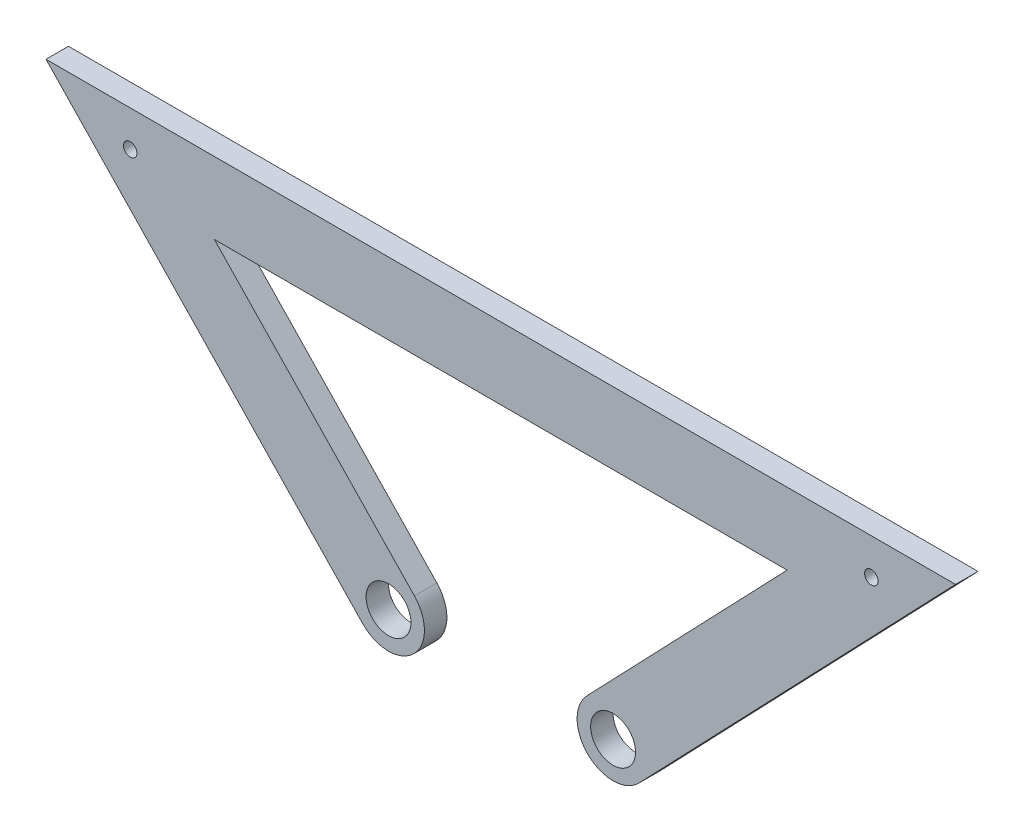
ISO-10303-21;
HEADER;
FILE_DESCRIPTION(('STEP AP214'),'2;1');
FILE_NAME('part.step','',(''),(''),'','','');
FILE_SCHEMA(('AUTOMOTIVE_DESIGN { 1 0 10303 214 1 1 1 1 }'));
ENDSEC;
DATA;
#1=APPLICATION_CONTEXT('core data for automotive mechanical design processes');
#2=APPLICATION_PROTOCOL_DEFINITION('international standard','automotive_design',2000,#1);
#3=PRODUCT_CONTEXT('',#1,'mechanical');
#4=PRODUCT('Part','Part','',(#3));
#5=PRODUCT_RELATED_PRODUCT_CATEGORY('part','',(#4));
#6=PRODUCT_DEFINITION_FORMATION('','',#4);
#7=PRODUCT_DEFINITION_CONTEXT('part definition',#1,'design');
#8=PRODUCT_DEFINITION('design','',#6,#7);
#9=PRODUCT_DEFINITION_SHAPE('','',#8);
#10=(LENGTH_UNIT() NAMED_UNIT(*) SI_UNIT(.MILLI.,.METRE.));
#11=(NAMED_UNIT(*) PLANE_ANGLE_UNIT() SI_UNIT($,.RADIAN.));
#12=(NAMED_UNIT(*) SI_UNIT($,.STERADIAN.) SOLID_ANGLE_UNIT());
#13=UNCERTAINTY_MEASURE_WITH_UNIT(LENGTH_MEASURE(1.E-05),#10,'distance_accuracy_value','');
#14=(GEOMETRIC_REPRESENTATION_CONTEXT(3) GLOBAL_UNCERTAINTY_ASSIGNED_CONTEXT((#13)) GLOBAL_UNIT_ASSIGNED_CONTEXT((#10,
#11,#12)) REPRESENTATION_CONTEXT('',''));
#15=CARTESIAN_POINT('',(0.,0.,0.));
#16=DIRECTION('',(0.,0.,1.));
#17=DIRECTION('',(1.,0.,0.));
#18=AXIS2_PLACEMENT_3D('',#15,#16,#17);
#19=CARTESIAN_POINT('',(-101.247180092397,112.78837439414,-7.5));
#20=DIRECTION('',(-0.721988205115424,-0.691905363235615,0.));
#21=DIRECTION('',(0.691905363235615,-0.721988205115424,0.));
#22=AXIS2_PLACEMENT_3D('',#19,#20,#21);
#23=PLANE('',#22);
#24=DIRECTION('',(0.691905363235615,-0.721988205115424,0.));
#25=VECTOR('',#24,1.);
#26=CARTESIAN_POINT('',(-101.247180092397,112.78837439414,-2.5));
#27=LINE('',#26,#25);
#28=CARTESIAN_POINT('',(-101.247180092397,112.78837439414,-2.5));
#29=VERTEX_POINT('',#28);
#30=CARTESIAN_POINT('',(-30.7759056409234,39.2531314882555,-2.5));
#31=VERTEX_POINT('',#30);
#32=EDGE_CURVE('E133',#29,#31,#27,.T.);
#33=ORIENTED_EDGE('',*,*,#32,.F.);
#34=DIRECTION('',(0.,0.,1.));
#35=VECTOR('',#34,1.);
#36=CARTESIAN_POINT('',(-101.247180092397,112.78837439414,-7.5));
#37=LINE('',#36,#35);
#38=CARTESIAN_POINT('',(-101.247180092397,112.78837439414,-7.5));
#39=VERTEX_POINT('',#38);
#40=EDGE_CURVE('E11',#39,#29,#37,.T.);
#41=ORIENTED_EDGE('',*,*,#40,.F.);
#42=DIRECTION('',(0.691905363235615,-0.721988205115424,0.));
#43=VECTOR('',#42,1.);
#44=CARTESIAN_POINT('',(-101.247180092397,112.78837439414,-7.5));
#45=LINE('',#44,#43);
#46=CARTESIAN_POINT('',(-30.7759056409234,39.2531314882555,-7.5));
#47=VERTEX_POINT('',#46);
#48=EDGE_CURVE('E151',#39,#47,#45,.T.);
#49=ORIENTED_EDGE('',*,*,#48,.T.);
#50=DIRECTION('',(0.,0.,1.));
#51=VECTOR('',#50,1.);
#52=CARTESIAN_POINT('',(-30.7759056409234,39.2531314882555,-7.5));
#53=LINE('',#52,#51);
#54=EDGE_CURVE('E38',#47,#31,#53,.T.);
#55=ORIENTED_EDGE('',*,*,#54,.T.);
#56=EDGE_LOOP('',(#33,#41,#49,#55));
#57=FACE_BOUND('',#56,.T.);
#58=ADVANCED_FACE('F35',(#57),#23,.T.);
#59=CARTESIAN_POINT('',(-101.247180092397,112.78837439414,-7.5));
#60=DIRECTION('',(0.,-1.,0.));
#61=DIRECTION('',(0.,0.,-1.));
#62=AXIS2_PLACEMENT_3D('',#59,#60,#61);
#63=PLANE('',#62);
#64=DIRECTION('',(1.,0.,0.));
#65=VECTOR('',#64,1.);
#66=CARTESIAN_POINT('',(-101.247180092397,112.78837439414,-2.5));
#67=LINE('',#66,#65);
#68=CARTESIAN_POINT('',(101.247180092396,112.78837439414,-2.5));
#69=VERTEX_POINT('',#68);
#70=EDGE_CURVE('E80',#29,#69,#67,.T.);
#71=ORIENTED_EDGE('',*,*,#70,.T.);
#72=DIRECTION('',(0.,0.,1.));
#73=VECTOR('',#72,1.);
#74=CARTESIAN_POINT('',(101.247180092396,112.78837439414,-7.5));
#75=LINE('',#74,#73);
#76=CARTESIAN_POINT('',(101.247180092396,112.78837439414,-7.5));
#77=VERTEX_POINT('',#76);
#78=EDGE_CURVE('E44',#77,#69,#75,.T.);
#79=ORIENTED_EDGE('',*,*,#78,.F.);
#80=DIRECTION('',(1.,0.,0.));
#81=VECTOR('',#80,1.);
#82=CARTESIAN_POINT('',(-101.247180092397,112.78837439414,-7.5));
#83=LINE('',#82,#81);
#84=EDGE_CURVE('E112',#39,#77,#83,.T.);
#85=ORIENTED_EDGE('',*,*,#84,.F.);
#86=ORIENTED_EDGE('',*,*,#40,.T.);
#87=EDGE_LOOP('',(#71,#79,#85,#86));
#88=FACE_BOUND('',#87,.T.);
#89=ADVANCED_FACE('F236',(#88),#63,.F.);
#90=CARTESIAN_POINT('',(101.247180092396,112.78837439414,-7.5));
#91=DIRECTION('',(-0.721988205115424,0.691905363235615,0.));
#92=DIRECTION('',(-0.691905363235615,-0.721988205115424,0.));
#93=AXIS2_PLACEMENT_3D('',#90,#91,#92);
#94=PLANE('',#93);
#95=DIRECTION('',(-0.691905363235615,-0.721988205115424,0.));
#96=VECTOR('',#95,1.);
#97=CARTESIAN_POINT('',(101.247180092396,112.78837439414,-2.5));
#98=LINE('',#97,#96);
#99=CARTESIAN_POINT('',(30.7759056409234,39.2531314882555,-2.5));
#100=VERTEX_POINT('',#99);
#101=EDGE_CURVE('E119',#69,#100,#98,.T.);
#102=ORIENTED_EDGE('',*,*,#101,.T.);
#103=DIRECTION('',(0.,0.,1.));
#104=VECTOR('',#103,1.);
#105=CARTESIAN_POINT('',(30.7759056409234,39.2531314882555,-7.5));
#106=LINE('',#105,#104);
#107=CARTESIAN_POINT('',(30.7759056409234,39.2531314882555,-7.5));
#108=VERTEX_POINT('',#107);
#109=EDGE_CURVE('E116',#108,#100,#106,.T.);
#110=ORIENTED_EDGE('',*,*,#109,.F.);
#111=DIRECTION('',(-0.691905363235615,-0.721988205115424,0.));
#112=VECTOR('',#111,1.);
#113=CARTESIAN_POINT('',(101.247180092396,112.78837439414,-7.5));
#114=LINE('',#113,#112);
#115=EDGE_CURVE('E105',#77,#108,#114,.T.);
#116=ORIENTED_EDGE('',*,*,#115,.F.);
#117=ORIENTED_EDGE('',*,*,#78,.T.);
#118=EDGE_LOOP('',(#102,#110,#116,#117));
#119=FACE_BOUND('',#118,.T.);
#120=ADVANCED_FACE('F117',(#119),#94,.F.);
#121=CARTESIAN_POINT('',(25.,44.7883743941404,-7.5));
#122=DIRECTION('',(0.,0.,1.));
#123=DIRECTION('',(1.,0.,0.));
#124=AXIS2_PLACEMENT_3D('',#121,#122,#123);
#125=CYLINDRICAL_SURFACE('',#124,8.);
#126=CARTESIAN_POINT('',(25.,44.7883743941404,-2.5));
#127=DIRECTION('',(0.,0.,1.));
#128=DIRECTION('',(1.,0.,0.));
#129=AXIS2_PLACEMENT_3D('',#126,#127,#128);
#130=CIRCLE('',#129,8.);
#131=CARTESIAN_POINT('',(19.2240943590766,50.3236173000254,-2.5));
#132=VERTEX_POINT('',#131);
#133=EDGE_CURVE('E148',#132,#100,#130,.T.);
#134=ORIENTED_EDGE('',*,*,#133,.F.);
#135=DIRECTION('',(0.,0.,1.));
#136=VECTOR('',#135,1.);
#137=CARTESIAN_POINT('',(19.2240943590766,50.3236173000254,-7.5));
#138=LINE('',#137,#136);
#139=CARTESIAN_POINT('',(19.2240943590766,50.3236173000254,-7.5));
#140=VERTEX_POINT('',#139);
#141=EDGE_CURVE('E123',#140,#132,#138,.T.);
#142=ORIENTED_EDGE('',*,*,#141,.F.);
#143=CARTESIAN_POINT('',(25.,44.7883743941404,-7.5));
#144=DIRECTION('',(0.,0.,1.));
#145=DIRECTION('',(1.,0.,0.));
#146=AXIS2_PLACEMENT_3D('',#143,#144,#145);
#147=CIRCLE('',#146,8.);
#148=EDGE_CURVE('E110',#140,#108,#147,.T.);
#149=ORIENTED_EDGE('',*,*,#148,.T.);
#150=ORIENTED_EDGE('',*,*,#109,.T.);
#151=EDGE_LOOP('',(#134,#142,#149,#150));
#152=FACE_BOUND('',#151,.T.);
#153=ADVANCED_FACE('F125',(#152),#125,.T.);
#154=CARTESIAN_POINT('',(63.7528199076035,96.7883743941404,-7.5));
#155=DIRECTION('',(-0.721988205115424,0.691905363235615,0.));
#156=DIRECTION('',(-0.691905363235615,-0.721988205115424,0.));
#157=AXIS2_PLACEMENT_3D('',#154,#155,#156);
#158=PLANE('',#157);
#159=DIRECTION('',(-0.691905363235615,-0.721988205115424,0.));
#160=VECTOR('',#159,1.);
#161=CARTESIAN_POINT('',(63.7528199076035,96.7883743941404,-2.5));
#162=LINE('',#161,#160);
#163=CARTESIAN_POINT('',(63.7528199076035,96.7883743941404,-2.5));
#164=VERTEX_POINT('',#163);
#165=EDGE_CURVE('E145',#164,#132,#162,.T.);
#166=ORIENTED_EDGE('',*,*,#165,.F.);
#167=DIRECTION('',(0.,0.,1.));
#168=VECTOR('',#167,1.);
#169=CARTESIAN_POINT('',(63.7528199076035,96.7883743941404,-7.5));
#170=LINE('',#169,#168);
#171=CARTESIAN_POINT('',(63.7528199076035,96.7883743941404,-7.5));
#172=VERTEX_POINT('',#171);
#173=EDGE_CURVE('E155',#172,#164,#170,.T.);
#174=ORIENTED_EDGE('',*,*,#173,.F.);
#175=DIRECTION('',(-0.691905363235615,-0.721988205115424,0.));
#176=VECTOR('',#175,1.);
#177=CARTESIAN_POINT('',(63.7528199076035,96.7883743941404,-7.5));
#178=LINE('',#177,#176);
#179=EDGE_CURVE('E126',#172,#140,#178,.T.);
#180=ORIENTED_EDGE('',*,*,#179,.T.);
#181=ORIENTED_EDGE('',*,*,#141,.T.);
#182=EDGE_LOOP('',(#166,#174,#180,#181));
#183=FACE_BOUND('',#182,.T.);
#184=ADVANCED_FACE('F170',(#183),#158,.T.);
#185=CARTESIAN_POINT('',(-63.7528199076036,96.7883743941404,-7.5));
#186=DIRECTION('',(0.,-1.,0.));
#187=DIRECTION('',(0.,0.,-1.));
#188=AXIS2_PLACEMENT_3D('',#185,#186,#187);
#189=PLANE('',#188);
#190=DIRECTION('',(1.,0.,0.));
#191=VECTOR('',#190,1.);
#192=CARTESIAN_POINT('',(-63.7528199076036,96.7883743941404,-2.5));
#193=LINE('',#192,#191);
#194=CARTESIAN_POINT('',(-63.7528199076036,96.7883743941404,-2.5));
#195=VERTEX_POINT('',#194);
#196=EDGE_CURVE('E142',#195,#164,#193,.T.);
#197=ORIENTED_EDGE('',*,*,#196,.F.);
#198=DIRECTION('',(0.,0.,1.));
#199=VECTOR('',#198,1.);
#200=CARTESIAN_POINT('',(-63.7528199076036,96.7883743941404,-7.5));
#201=LINE('',#200,#199);
#202=CARTESIAN_POINT('',(-63.7528199076036,96.7883743941404,-7.5));
#203=VERTEX_POINT('',#202);
#204=EDGE_CURVE('E157',#203,#195,#201,.T.);
#205=ORIENTED_EDGE('',*,*,#204,.F.);
#206=DIRECTION('',(1.,0.,0.));
#207=VECTOR('',#206,1.);
#208=CARTESIAN_POINT('',(-63.7528199076036,96.7883743941404,-7.5));
#209=LINE('',#208,#207);
#210=EDGE_CURVE('E128',#203,#172,#209,.T.);
#211=ORIENTED_EDGE('',*,*,#210,.T.);
#212=ORIENTED_EDGE('',*,*,#173,.T.);
#213=EDGE_LOOP('',(#197,#205,#211,#212));
#214=FACE_BOUND('',#213,.T.);
#215=ADVANCED_FACE('F174',(#214),#189,.T.);
#216=CARTESIAN_POINT('',(-63.7528199076036,96.7883743941404,-7.5));
#217=DIRECTION('',(-0.721988205115424,-0.691905363235615,0.));
#218=DIRECTION('',(0.691905363235615,-0.721988205115424,0.));
#219=AXIS2_PLACEMENT_3D('',#216,#217,#218);
#220=PLANE('',#219);
#221=DIRECTION('',(0.691905363235615,-0.721988205115424,0.));
#222=VECTOR('',#221,1.);
#223=CARTESIAN_POINT('',(-63.7528199076036,96.7883743941404,-2.5));
#224=LINE('',#223,#222);
#225=CARTESIAN_POINT('',(-19.2240943590766,50.3236173000253,-2.5));
#226=VERTEX_POINT('',#225);
#227=EDGE_CURVE('E140',#195,#226,#224,.T.);
#228=ORIENTED_EDGE('',*,*,#227,.T.);
#229=DIRECTION('',(0.,0.,1.));
#230=VECTOR('',#229,1.);
#231=CARTESIAN_POINT('',(-19.2240943590766,50.3236173000253,-7.5));
#232=LINE('',#231,#230);
#233=CARTESIAN_POINT('',(-19.2240943590766,50.3236173000253,-7.5));
#234=VERTEX_POINT('',#233);
#235=EDGE_CURVE('E158',#234,#226,#232,.T.);
#236=ORIENTED_EDGE('',*,*,#235,.F.);
#237=DIRECTION('',(0.691905363235615,-0.721988205115424,0.));
#238=VECTOR('',#237,1.);
#239=CARTESIAN_POINT('',(-63.7528199076036,96.7883743941404,-7.5));
#240=LINE('',#239,#238);
#241=EDGE_CURVE('E176',#203,#234,#240,.T.);
#242=ORIENTED_EDGE('',*,*,#241,.F.);
#243=ORIENTED_EDGE('',*,*,#204,.T.);
#244=EDGE_LOOP('',(#228,#236,#242,#243));
#245=FACE_BOUND('',#244,.T.);
#246=ADVANCED_FACE('F252',(#245),#220,.F.);
#247=CARTESIAN_POINT('',(-25.,44.7883743941404,-7.5));
#248=DIRECTION('',(0.,0.,1.));
#249=DIRECTION('',(1.,0.,0.));
#250=AXIS2_PLACEMENT_3D('',#247,#248,#249);
#251=CYLINDRICAL_SURFACE('',#250,8.);
#252=CARTESIAN_POINT('',(-25.,44.7883743941404,-2.5));
#253=DIRECTION('',(0.,0.,-1.));
#254=DIRECTION('',(-1.,0.,0.));
#255=AXIS2_PLACEMENT_3D('',#252,#253,#254);
#256=CIRCLE('',#255,8.);
#257=EDGE_CURVE('E136',#226,#31,#256,.T.);
#258=ORIENTED_EDGE('',*,*,#257,.T.);
#259=ORIENTED_EDGE('',*,*,#54,.F.);
#260=CARTESIAN_POINT('',(-25.,44.7883743941404,-7.5));
#261=DIRECTION('',(0.,0.,-1.));
#262=DIRECTION('',(-1.,0.,0.));
#263=AXIS2_PLACEMENT_3D('',#260,#261,#262);
#264=CIRCLE('',#263,8.);
#265=EDGE_CURVE('E90',#234,#47,#264,.T.);
#266=ORIENTED_EDGE('',*,*,#265,.F.);
#267=ORIENTED_EDGE('',*,*,#235,.T.);
#268=EDGE_LOOP('',(#258,#259,#266,#267));
#269=FACE_BOUND('',#268,.T.);
#270=ADVANCED_FACE('F163',(#269),#251,.T.);
#271=CARTESIAN_POINT('',(-25.,44.7883743941404,-7.5));
#272=DIRECTION('',(0.,0.,-1.));
#273=DIRECTION('',(-1.,0.,0.));
#274=AXIS2_PLACEMENT_3D('',#271,#272,#273);
#275=PLANE('',#274);
#276=CARTESIAN_POINT('',(-82.5,104.78837439414,-7.5));
#277=DIRECTION('',(0.,0.,1.));
#278=DIRECTION('',(1.,0.,0.));
#279=AXIS2_PLACEMENT_3D('',#276,#277,#278);
#280=CIRCLE('',#279,1.5);
#281=CARTESIAN_POINT('',(-81.,104.78837439414,-7.5));
#282=VERTEX_POINT('',#281);
#283=EDGE_CURVE('E137',#282,#282,#280,.T.);
#284=ORIENTED_EDGE('',*,*,#283,.T.);
#285=EDGE_LOOP('',(#284));
#286=FACE_BOUND('',#285,.T.);
#287=CARTESIAN_POINT('',(82.5,104.78837439414,-7.5));
#288=DIRECTION('',(0.,0.,1.));
#289=DIRECTION('',(1.,0.,0.));
#290=AXIS2_PLACEMENT_3D('',#287,#288,#289);
#291=CIRCLE('',#290,1.5);
#292=CARTESIAN_POINT('',(84.,104.78837439414,-7.5));
#293=VERTEX_POINT('',#292);
#294=EDGE_CURVE('E193',#293,#293,#291,.T.);
#295=ORIENTED_EDGE('',*,*,#294,.T.);
#296=EDGE_LOOP('',(#295));
#297=FACE_BOUND('',#296,.T.);
#298=CARTESIAN_POINT('',(25.,44.7883743941404,-7.5));
#299=DIRECTION('',(0.,0.,1.));
#300=DIRECTION('',(1.,0.,0.));
#301=AXIS2_PLACEMENT_3D('',#298,#299,#300);
#302=CIRCLE('',#301,5.);
#303=CARTESIAN_POINT('',(30.,44.7883743941404,-7.5));
#304=VERTEX_POINT('',#303);
#305=EDGE_CURVE('E187',#304,#304,#302,.T.);
#306=ORIENTED_EDGE('',*,*,#305,.T.);
#307=EDGE_LOOP('',(#306));
#308=FACE_BOUND('',#307,.T.);
#309=CARTESIAN_POINT('',(-25.,44.7883743941404,-7.5));
#310=DIRECTION('',(0.,0.,1.));
#311=DIRECTION('',(1.,0.,0.));
#312=AXIS2_PLACEMENT_3D('',#309,#310,#311);
#313=CIRCLE('',#312,5.);
#314=CARTESIAN_POINT('',(-20.,44.7883743941404,-7.5));
#315=VERTEX_POINT('',#314);
#316=EDGE_CURVE('E181',#315,#315,#313,.T.);
#317=ORIENTED_EDGE('',*,*,#316,.T.);
#318=EDGE_LOOP('',(#317));
#319=FACE_BOUND('',#318,.T.);
#320=ORIENTED_EDGE('',*,*,#48,.F.);
#321=ORIENTED_EDGE('',*,*,#84,.T.);
#322=ORIENTED_EDGE('',*,*,#115,.T.);
#323=ORIENTED_EDGE('',*,*,#148,.F.);
#324=ORIENTED_EDGE('',*,*,#179,.F.);
#325=ORIENTED_EDGE('',*,*,#210,.F.);
#326=ORIENTED_EDGE('',*,*,#241,.T.);
#327=ORIENTED_EDGE('',*,*,#265,.T.);
#328=EDGE_LOOP('',(#320,#321,#322,#323,#324,#325,#326,#327));
#329=FACE_BOUND('',#328,.T.);
#330=ADVANCED_FACE('F107',(#286,#297,#308,#319,#329),#275,.T.);
#331=CARTESIAN_POINT('',(-25.,44.7883743941404,-2.5));
#332=DIRECTION('',(0.,0.,-1.));
#333=DIRECTION('',(-1.,0.,0.));
#334=AXIS2_PLACEMENT_3D('',#331,#332,#333);
#335=PLANE('',#334);
#336=CARTESIAN_POINT('',(-82.5,104.78837439414,-2.5));
#337=DIRECTION('',(0.,0.,1.));
#338=DIRECTION('',(1.,0.,0.));
#339=AXIS2_PLACEMENT_3D('',#336,#337,#338);
#340=CIRCLE('',#339,1.5);
#341=CARTESIAN_POINT('',(-81.,104.78837439414,-2.5));
#342=VERTEX_POINT('',#341);
#343=EDGE_CURVE('E199',#342,#342,#340,.T.);
#344=ORIENTED_EDGE('',*,*,#343,.F.);
#345=EDGE_LOOP('',(#344));
#346=FACE_BOUND('',#345,.T.);
#347=CARTESIAN_POINT('',(82.5,104.78837439414,-2.5));
#348=DIRECTION('',(0.,0.,1.));
#349=DIRECTION('',(1.,0.,0.));
#350=AXIS2_PLACEMENT_3D('',#347,#348,#349);
#351=CIRCLE('',#350,1.5);
#352=CARTESIAN_POINT('',(84.,104.78837439414,-2.5));
#353=VERTEX_POINT('',#352);
#354=EDGE_CURVE('E196',#353,#353,#351,.T.);
#355=ORIENTED_EDGE('',*,*,#354,.F.);
#356=EDGE_LOOP('',(#355));
#357=FACE_BOUND('',#356,.T.);
#358=CARTESIAN_POINT('',(25.,44.7883743941404,-2.5));
#359=DIRECTION('',(0.,0.,1.));
#360=DIRECTION('',(1.,0.,0.));
#361=AXIS2_PLACEMENT_3D('',#358,#359,#360);
#362=CIRCLE('',#361,5.);
#363=CARTESIAN_POINT('',(30.,44.7883743941404,-2.5));
#364=VERTEX_POINT('',#363);
#365=EDGE_CURVE('E190',#364,#364,#362,.T.);
#366=ORIENTED_EDGE('',*,*,#365,.F.);
#367=EDGE_LOOP('',(#366));
#368=FACE_BOUND('',#367,.T.);
#369=CARTESIAN_POINT('',(-25.,44.7883743941404,-2.5));
#370=DIRECTION('',(0.,0.,1.));
#371=DIRECTION('',(1.,0.,0.));
#372=AXIS2_PLACEMENT_3D('',#369,#370,#371);
#373=CIRCLE('',#372,5.);
#374=CARTESIAN_POINT('',(-20.,44.7883743941404,-2.5));
#375=VERTEX_POINT('',#374);
#376=EDGE_CURVE('E184',#375,#375,#373,.T.);
#377=ORIENTED_EDGE('',*,*,#376,.F.);
#378=EDGE_LOOP('',(#377));
#379=FACE_BOUND('',#378,.T.);
#380=ORIENTED_EDGE('',*,*,#32,.T.);
#381=ORIENTED_EDGE('',*,*,#257,.F.);
#382=ORIENTED_EDGE('',*,*,#227,.F.);
#383=ORIENTED_EDGE('',*,*,#196,.T.);
#384=ORIENTED_EDGE('',*,*,#165,.T.);
#385=ORIENTED_EDGE('',*,*,#133,.T.);
#386=ORIENTED_EDGE('',*,*,#101,.F.);
#387=ORIENTED_EDGE('',*,*,#70,.F.);
#388=EDGE_LOOP('',(#380,#381,#382,#383,#384,#385,#386,#387));
#389=FACE_BOUND('',#388,.T.);
#390=ADVANCED_FACE('F166',(#346,#357,#368,#379,#389),#335,.F.);
#391=CARTESIAN_POINT('',(-25.,44.7883743941404,-7.5));
#392=DIRECTION('',(0.,0.,1.));
#393=DIRECTION('',(1.,0.,0.));
#394=AXIS2_PLACEMENT_3D('',#391,#392,#393);
#395=CYLINDRICAL_SURFACE('',#394,5.);
#396=ORIENTED_EDGE('',*,*,#316,.F.);
#397=EDGE_LOOP('',(#396));
#398=FACE_BOUND('',#397,.T.);
#399=ORIENTED_EDGE('',*,*,#376,.T.);
#400=EDGE_LOOP('',(#399));
#401=FACE_BOUND('',#400,.T.);
#402=ADVANCED_FACE('F216',(#398,#401),#395,.F.);
#403=CARTESIAN_POINT('',(25.,44.7883743941404,-7.5));
#404=DIRECTION('',(0.,0.,1.));
#405=DIRECTION('',(1.,0.,0.));
#406=AXIS2_PLACEMENT_3D('',#403,#404,#405);
#407=CYLINDRICAL_SURFACE('',#406,5.);
#408=ORIENTED_EDGE('',*,*,#305,.F.);
#409=EDGE_LOOP('',(#408));
#410=FACE_BOUND('',#409,.T.);
#411=ORIENTED_EDGE('',*,*,#365,.T.);
#412=EDGE_LOOP('',(#411));
#413=FACE_BOUND('',#412,.T.);
#414=ADVANCED_FACE('F225',(#410,#413),#407,.F.);
#415=CARTESIAN_POINT('',(82.5,104.78837439414,-7.5));
#416=DIRECTION('',(0.,0.,1.));
#417=DIRECTION('',(1.,0.,0.));
#418=AXIS2_PLACEMENT_3D('',#415,#416,#417);
#419=CYLINDRICAL_SURFACE('',#418,1.5);
#420=ORIENTED_EDGE('',*,*,#294,.F.);
#421=EDGE_LOOP('',(#420));
#422=FACE_BOUND('',#421,.T.);
#423=ORIENTED_EDGE('',*,*,#354,.T.);
#424=EDGE_LOOP('',(#423));
#425=FACE_BOUND('',#424,.T.);
#426=ADVANCED_FACE('F210',(#422,#425),#419,.F.);
#427=CARTESIAN_POINT('',(-82.5,104.78837439414,-7.5));
#428=DIRECTION('',(0.,0.,1.));
#429=DIRECTION('',(1.,0.,0.));
#430=AXIS2_PLACEMENT_3D('',#427,#428,#429);
#431=CYLINDRICAL_SURFACE('',#430,1.5);
#432=ORIENTED_EDGE('',*,*,#283,.F.);
#433=EDGE_LOOP('',(#432));
#434=FACE_BOUND('',#433,.T.);
#435=ORIENTED_EDGE('',*,*,#343,.T.);
#436=EDGE_LOOP('',(#435));
#437=FACE_BOUND('',#436,.T.);
#438=ADVANCED_FACE('F207',(#434,#437),#431,.F.);
#439=CLOSED_SHELL('',(#58,#89,#120,#153,#184,#215,#246,#270,#330,#390,#402,#414,#426,#438));
#440=MANIFOLD_SOLID_BREP('B2',#439);
#441=ADVANCED_BREP_SHAPE_REPRESENTATION('',(#18,#440),#14);
#442=SHAPE_DEFINITION_REPRESENTATION(#9,#441);
ENDSEC;
END-ISO-10303-21;
